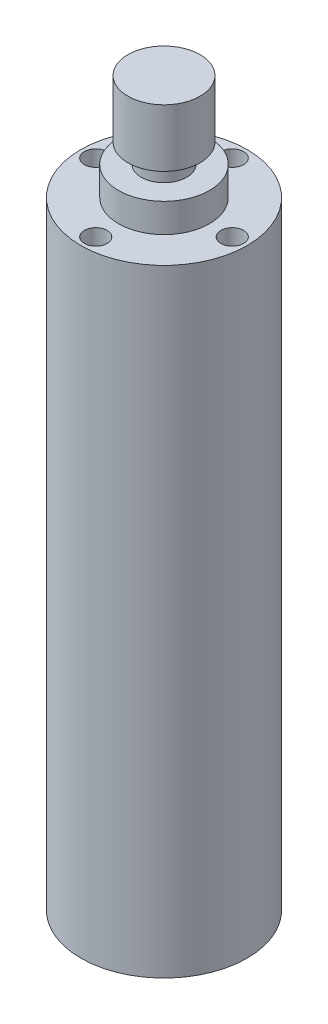
ISO-10303-21;
HEADER;
FILE_DESCRIPTION(('STEP AP214'),'2;1');
FILE_NAME('part.step','',(''),(''),'','','');
FILE_SCHEMA(('AUTOMOTIVE_DESIGN { 1 0 10303 214 1 1 1 1 }'));
ENDSEC;
DATA;
#1=APPLICATION_CONTEXT('core data for automotive mechanical design processes');
#2=APPLICATION_PROTOCOL_DEFINITION('international standard','automotive_design',2000,#1);
#3=PRODUCT_CONTEXT('',#1,'mechanical');
#4=PRODUCT('Part','Part','',(#3));
#5=PRODUCT_RELATED_PRODUCT_CATEGORY('part','',(#4));
#6=PRODUCT_DEFINITION_FORMATION('','',#4);
#7=PRODUCT_DEFINITION_CONTEXT('part definition',#1,'design');
#8=PRODUCT_DEFINITION('design','',#6,#7);
#9=PRODUCT_DEFINITION_SHAPE('','',#8);
#10=(LENGTH_UNIT() NAMED_UNIT(*) SI_UNIT(.MILLI.,.METRE.));
#11=(NAMED_UNIT(*) PLANE_ANGLE_UNIT() SI_UNIT($,.RADIAN.));
#12=(NAMED_UNIT(*) SI_UNIT($,.STERADIAN.) SOLID_ANGLE_UNIT());
#13=UNCERTAINTY_MEASURE_WITH_UNIT(LENGTH_MEASURE(1.E-05),#10,'distance_accuracy_value','');
#14=(GEOMETRIC_REPRESENTATION_CONTEXT(3) GLOBAL_UNCERTAINTY_ASSIGNED_CONTEXT((#13)) GLOBAL_UNIT_ASSIGNED_CONTEXT((#10,
#11,#12)) REPRESENTATION_CONTEXT('',''));
#15=CARTESIAN_POINT('',(0.,0.,0.));
#16=DIRECTION('',(0.,0.,1.));
#17=DIRECTION('',(1.,0.,0.));
#18=AXIS2_PLACEMENT_3D('',#15,#16,#17);
#19=CARTESIAN_POINT('',(0.,40.767,0.));
#20=DIRECTION('',(0.,-1.,0.));
#21=DIRECTION('',(0.,0.,-1.));
#22=AXIS2_PLACEMENT_3D('',#19,#20,#21);
#23=CYLINDRICAL_SURFACE('',#22,10.9855);
#24=CARTESIAN_POINT('',(0.,40.767,0.));
#25=DIRECTION('',(0.,1.,0.));
#26=DIRECTION('',(0.,0.,1.));
#27=AXIS2_PLACEMENT_3D('',#24,#25,#26);
#28=CIRCLE('',#27,10.9855);
#29=CARTESIAN_POINT('',(0.,40.767,10.9855));
#30=VERTEX_POINT('',#29);
#31=EDGE_CURVE('E51',#30,#30,#28,.T.);
#32=ORIENTED_EDGE('',*,*,#31,.F.);
#33=EDGE_LOOP('',(#32));
#34=FACE_BOUND('',#33,.T.);
#35=CARTESIAN_POINT('',(0.,-40.767,0.));
#36=DIRECTION('',(0.,1.,0.));
#37=DIRECTION('',(0.,0.,1.));
#38=AXIS2_PLACEMENT_3D('',#35,#36,#37);
#39=CIRCLE('',#38,10.9855);
#40=CARTESIAN_POINT('',(0.,-40.767,10.9855));
#41=VERTEX_POINT('',#40);
#42=EDGE_CURVE('E40',#41,#41,#39,.T.);
#43=ORIENTED_EDGE('',*,*,#42,.T.);
#44=EDGE_LOOP('',(#43));
#45=FACE_BOUND('',#44,.T.);
#46=ADVANCED_FACE('F37',(#34,#45),#23,.T.);
#47=CARTESIAN_POINT('',(0.,40.767,0.));
#48=DIRECTION('',(0.,1.,0.));
#49=DIRECTION('',(0.,0.,1.));
#50=AXIS2_PLACEMENT_3D('',#47,#48,#49);
#51=PLANE('',#50);
#52=CARTESIAN_POINT('',(-9.017,40.767,0.));
#53=DIRECTION('',(0.,1.,0.));
#54=DIRECTION('',(1.,0.,0.));
#55=AXIS2_PLACEMENT_3D('',#52,#53,#54);
#56=CIRCLE('',#55,1.5);
#57=CARTESIAN_POINT('',(-9.017,40.767,1.50000000000003));
#58=VERTEX_POINT('',#57);
#59=EDGE_CURVE('E276',#58,#58,#56,.T.);
#60=ORIENTED_EDGE('',*,*,#59,.F.);
#61=EDGE_LOOP('',(#60));
#62=FACE_BOUND('',#61,.T.);
#63=CARTESIAN_POINT('',(0.,40.767,9.017));
#64=DIRECTION('',(0.,1.,0.));
#65=DIRECTION('',(0.,0.,-1.));
#66=AXIS2_PLACEMENT_3D('',#63,#64,#65);
#67=CIRCLE('',#66,1.5);
#68=CARTESIAN_POINT('',(0.,40.767,10.517));
#69=VERTEX_POINT('',#68);
#70=EDGE_CURVE('E268',#69,#69,#67,.T.);
#71=ORIENTED_EDGE('',*,*,#70,.F.);
#72=EDGE_LOOP('',(#71));
#73=FACE_BOUND('',#72,.T.);
#74=CARTESIAN_POINT('',(9.017,40.767,0.));
#75=DIRECTION('',(0.,1.,0.));
#76=DIRECTION('',(-1.,0.,0.));
#77=AXIS2_PLACEMENT_3D('',#74,#75,#76);
#78=CIRCLE('',#77,1.5);
#79=CARTESIAN_POINT('',(9.017,40.767,1.49999999999991));
#80=VERTEX_POINT('',#79);
#81=EDGE_CURVE('E260',#80,#80,#78,.T.);
#82=ORIENTED_EDGE('',*,*,#81,.F.);
#83=EDGE_LOOP('',(#82));
#84=FACE_BOUND('',#83,.T.);
#85=CARTESIAN_POINT('',(0.,40.767,-9.017));
#86=DIRECTION('',(0.,1.,0.));
#87=DIRECTION('',(0.,0.,1.));
#88=AXIS2_PLACEMENT_3D('',#85,#86,#87);
#89=CIRCLE('',#88,1.5);
#90=CARTESIAN_POINT('',(0.,40.767,-7.517));
#91=VERTEX_POINT('',#90);
#92=EDGE_CURVE('E252',#91,#91,#89,.T.);
#93=ORIENTED_EDGE('',*,*,#92,.F.);
#94=EDGE_LOOP('',(#93));
#95=FACE_BOUND('',#94,.T.);
#96=CARTESIAN_POINT('',(0.,40.767,0.));
#97=DIRECTION('',(0.,1.,0.));
#98=DIRECTION('',(0.,0.,1.));
#99=AXIS2_PLACEMENT_3D('',#96,#97,#98);
#100=CIRCLE('',#99,6.0071);
#101=CARTESIAN_POINT('',(0.,40.767,-6.0071));
#102=VERTEX_POINT('',#101);
#103=EDGE_CURVE('E45',#102,#102,#100,.T.);
#104=ORIENTED_EDGE('',*,*,#103,.F.);
#105=EDGE_LOOP('',(#104));
#106=FACE_BOUND('',#105,.T.);
#107=ORIENTED_EDGE('',*,*,#31,.T.);
#108=EDGE_LOOP('',(#107));
#109=FACE_BOUND('',#108,.T.);
#110=ADVANCED_FACE('F72',(#62,#73,#84,#95,#106,#109),#51,.T.);
#111=CARTESIAN_POINT('',(0.,-40.767,0.));
#112=DIRECTION('',(0.,1.,0.));
#113=DIRECTION('',(0.,0.,1.));
#114=AXIS2_PLACEMENT_3D('',#111,#112,#113);
#115=PLANE('',#114);
#116=ORIENTED_EDGE('',*,*,#42,.F.);
#117=EDGE_LOOP('',(#116));
#118=FACE_BOUND('',#117,.T.);
#119=ADVANCED_FACE('F69',(#118),#115,.F.);
#120=CARTESIAN_POINT('',(0.,44.577,0.));
#121=DIRECTION('',(0.,-1.,0.));
#122=DIRECTION('',(0.,0.,-1.));
#123=AXIS2_PLACEMENT_3D('',#120,#121,#122);
#124=CYLINDRICAL_SURFACE('',#123,6.0071);
#125=CARTESIAN_POINT('',(0.,44.577,0.));
#126=DIRECTION('',(0.,1.,0.));
#127=DIRECTION('',(0.,0.,1.));
#128=AXIS2_PLACEMENT_3D('',#125,#126,#127);
#129=CIRCLE('',#128,6.0071);
#130=CARTESIAN_POINT('',(0.,44.577,-6.0071));
#131=VERTEX_POINT('',#130);
#132=EDGE_CURVE('E57',#131,#131,#129,.T.);
#133=CARTESIAN_POINT('',(0.,44.577,-6.0071));
#134=CARTESIAN_POINT('',(0.,44.5373125,-6.0071));
#135=CARTESIAN_POINT('',(0.,44.497625,-6.0071));
#136=CARTESIAN_POINT('',(0.,44.41825,-6.0071));
#137=CARTESIAN_POINT('',(0.,44.3785625,-6.0071));
#138=CARTESIAN_POINT('',(0.,44.2991875,-6.0071));
#139=CARTESIAN_POINT('',(0.,44.2595,-6.0071));
#140=CARTESIAN_POINT('',(0.,44.180125,-6.0071));
#141=CARTESIAN_POINT('',(0.,44.1404375,-6.0071));
#142=CARTESIAN_POINT('',(0.,44.0610625,-6.0071));
#143=CARTESIAN_POINT('',(0.,44.021375,-6.0071));
#144=CARTESIAN_POINT('',(0.,43.942,-6.0071));
#145=CARTESIAN_POINT('',(0.,43.9023125,-6.0071));
#146=CARTESIAN_POINT('',(0.,43.8229375,-6.0071));
#147=CARTESIAN_POINT('',(0.,43.78325,-6.0071));
#148=CARTESIAN_POINT('',(0.,43.703875,-6.0071));
#149=CARTESIAN_POINT('',(0.,43.6641875,-6.0071));
#150=CARTESIAN_POINT('',(0.,43.5848125,-6.0071));
#151=CARTESIAN_POINT('',(0.,43.545125,-6.0071));
#152=CARTESIAN_POINT('',(0.,43.46575,-6.0071));
#153=CARTESIAN_POINT('',(0.,43.4260625,-6.0071));
#154=CARTESIAN_POINT('',(0.,43.3466875,-6.0071));
#155=CARTESIAN_POINT('',(0.,43.307,-6.0071));
#156=CARTESIAN_POINT('',(0.,43.227625,-6.0071));
#157=CARTESIAN_POINT('',(0.,43.1879375,-6.0071));
#158=CARTESIAN_POINT('',(0.,43.1085625,-6.0071));
#159=CARTESIAN_POINT('',(0.,43.068875,-6.0071));
#160=CARTESIAN_POINT('',(0.,42.9895,-6.0071));
#161=CARTESIAN_POINT('',(0.,42.9498125,-6.0071));
#162=CARTESIAN_POINT('',(0.,42.8704375,-6.0071));
#163=CARTESIAN_POINT('',(0.,42.83075,-6.0071));
#164=CARTESIAN_POINT('',(0.,42.751375,-6.0071));
#165=CARTESIAN_POINT('',(0.,42.7116875,-6.0071));
#166=CARTESIAN_POINT('',(0.,42.6323125,-6.0071));
#167=CARTESIAN_POINT('',(0.,42.592625,-6.0071));
#168=CARTESIAN_POINT('',(0.,42.51325,-6.0071));
#169=CARTESIAN_POINT('',(0.,42.4735625,-6.0071));
#170=CARTESIAN_POINT('',(0.,42.3941875,-6.0071));
#171=CARTESIAN_POINT('',(0.,42.3545,-6.0071));
#172=CARTESIAN_POINT('',(0.,42.275125,-6.0071));
#173=CARTESIAN_POINT('',(0.,42.2354375,-6.0071));
#174=CARTESIAN_POINT('',(0.,42.1560625,-6.0071));
#175=CARTESIAN_POINT('',(0.,42.116375,-6.0071));
#176=CARTESIAN_POINT('',(0.,42.037,-6.0071));
#177=CARTESIAN_POINT('',(0.,41.9973125,-6.0071));
#178=CARTESIAN_POINT('',(0.,41.9179375,-6.0071));
#179=CARTESIAN_POINT('',(0.,41.87825,-6.0071));
#180=CARTESIAN_POINT('',(0.,41.798875,-6.0071));
#181=CARTESIAN_POINT('',(0.,41.7591875,-6.0071));
#182=CARTESIAN_POINT('',(0.,41.6798125,-6.0071));
#183=CARTESIAN_POINT('',(0.,41.640125,-6.0071));
#184=CARTESIAN_POINT('',(0.,41.56075,-6.0071));
#185=CARTESIAN_POINT('',(0.,41.5210625,-6.0071));
#186=CARTESIAN_POINT('',(0.,41.4416875,-6.0071));
#187=CARTESIAN_POINT('',(0.,41.402,-6.0071));
#188=CARTESIAN_POINT('',(0.,41.322625,-6.0071));
#189=CARTESIAN_POINT('',(0.,41.2829375,-6.0071));
#190=CARTESIAN_POINT('',(0.,41.2035625,-6.0071));
#191=CARTESIAN_POINT('',(0.,41.163875,-6.0071));
#192=CARTESIAN_POINT('',(0.,41.0845,-6.0071));
#193=CARTESIAN_POINT('',(0.,41.0448125,-6.0071));
#194=CARTESIAN_POINT('',(0.,40.9654375,-6.0071));
#195=CARTESIAN_POINT('',(0.,40.92575,-6.0071));
#196=CARTESIAN_POINT('',(0.,40.846375,-6.0071));
#197=CARTESIAN_POINT('',(0.,40.8066875,-6.0071));
#198=CARTESIAN_POINT('',(0.,40.767,-6.0071));
#199=B_SPLINE_CURVE_WITH_KNOTS('',3,(#133,#134,#135,#136,#137,#138,#139,#140,#141,#142,#143,
#144,#145,#146,#147,#148,#149,#150,#151,#152,#153,#154,#155,#156,#157,#158,#159,#160,#161,#162,
#163,#164,#165,#166,#167,#168,#169,#170,#171,#172,#173,#174,#175,#176,#177,#178,#179,#180,#181,
#182,#183,#184,#185,#186,#187,#188,#189,#190,#191,#192,#193,#194,#195,#196,#197,#198),
.UNSPECIFIED.,.F.,.F.,(4,2,2,2,2,2,2,2,2,2,2,2,2,2,2,2,2,2,2,2,2,2,2,2,2,2,2,2,2,2,2,2,4),(0.,
0.119062499999996,0.238124999999999,0.357187499999995,0.476249999999998,0.595312499999993,
0.714374999999996,0.833437499999999,0.952499999999995,1.0715625,1.19062499999999,1.3096875,
1.42875,1.5478125,1.666875,1.78593749999999,1.905,2.0240625,2.143125,2.2621875,2.38124999999999,
2.5003125,2.619375,2.7384375,2.8575,2.97656249999999,3.095625,3.2146875,3.33375,3.4528125,
3.571875,3.6909375,3.81),.UNSPECIFIED.);
#200=EDGE_CURVE('BSEAM71',#131,#102,#199,.T.);
#201=ORIENTED_EDGE('',*,*,#132,.F.);
#202=ORIENTED_EDGE('',*,*,#103,.T.);
#203=ORIENTED_EDGE('',*,*,#200,.T.);
#204=ORIENTED_EDGE('',*,*,#200,.F.);
#205=EDGE_LOOP('',(#201,#203,#202,#204));
#206=FACE_BOUND('',#205,.T.);
#207=ADVANCED_FACE('F71',(#206),#124,.T.);
#208=CARTESIAN_POINT('',(0.,44.577,0.));
#209=DIRECTION('',(0.,1.,0.));
#210=DIRECTION('',(0.,0.,1.));
#211=AXIS2_PLACEMENT_3D('',#208,#209,#210);
#212=PLANE('',#211);
#213=CARTESIAN_POINT('',(0.,44.577,0.));
#214=DIRECTION('',(0.,1.,0.));
#215=DIRECTION('',(0.,0.,1.));
#216=AXIS2_PLACEMENT_3D('',#213,#214,#215);
#217=CIRCLE('',#216,2.9972);
#218=CARTESIAN_POINT('',(0.,44.577,2.9972));
#219=VERTEX_POINT('',#218);
#220=EDGE_CURVE('E10',#219,#219,#217,.T.);
#221=ORIENTED_EDGE('',*,*,#220,.F.);
#222=EDGE_LOOP('',(#221));
#223=FACE_BOUND('',#222,.T.);
#224=ORIENTED_EDGE('',*,*,#132,.T.);
#225=EDGE_LOOP('',(#224));
#226=FACE_BOUND('',#225,.T.);
#227=ADVANCED_FACE('F77',(#223,#226),#212,.T.);
#228=CARTESIAN_POINT('',(0.,47.117,0.));
#229=DIRECTION('',(0.,-1.,0.));
#230=DIRECTION('',(0.,0.,-1.));
#231=AXIS2_PLACEMENT_3D('',#228,#229,#230);
#232=CYLINDRICAL_SURFACE('',#231,2.9972);
#233=CARTESIAN_POINT('',(0.,47.117,0.));
#234=DIRECTION('',(0.,1.,0.));
#235=DIRECTION('',(0.,0.,1.));
#236=AXIS2_PLACEMENT_3D('',#233,#234,#235);
#237=CIRCLE('',#236,2.9972);
#238=CARTESIAN_POINT('',(0.,47.117,2.9972));
#239=VERTEX_POINT('',#238);
#240=EDGE_CURVE('E55',#239,#239,#237,.T.);
#241=ORIENTED_EDGE('',*,*,#240,.F.);
#242=EDGE_LOOP('',(#241));
#243=FACE_BOUND('',#242,.T.);
#244=ORIENTED_EDGE('',*,*,#220,.T.);
#245=EDGE_LOOP('',(#244));
#246=FACE_BOUND('',#245,.T.);
#247=ADVANCED_FACE('F180',(#243,#246),#232,.T.);
#248=CARTESIAN_POINT('',(0.,54.737,0.));
#249=DIRECTION('',(0.,-1.,0.));
#250=DIRECTION('',(0.,0.,-1.));
#251=AXIS2_PLACEMENT_3D('',#248,#249,#250);
#252=CYLINDRICAL_SURFACE('',#251,4.7625);
#253=CARTESIAN_POINT('',(0.,54.737,0.));
#254=DIRECTION('',(0.,1.,0.));
#255=DIRECTION('',(0.,0.,1.));
#256=AXIS2_PLACEMENT_3D('',#253,#254,#255);
#257=CIRCLE('',#256,4.7625);
#258=CARTESIAN_POINT('',(0.,54.737,-4.7625));
#259=VERTEX_POINT('',#258);
#260=EDGE_CURVE('E242',#259,#259,#257,.T.);
#261=CARTESIAN_POINT('',(0.,47.117,0.));
#262=DIRECTION('',(0.,1.,0.));
#263=DIRECTION('',(0.,0.,1.));
#264=AXIS2_PLACEMENT_3D('',#261,#262,#263);
#265=CIRCLE('',#264,4.7625);
#266=CARTESIAN_POINT('',(0.,47.117,-4.7625));
#267=VERTEX_POINT('',#266);
#268=EDGE_CURVE('E245',#267,#267,#265,.T.);
#269=CARTESIAN_POINT('',(0.,54.737,-4.7625));
#270=CARTESIAN_POINT('',(0.,54.657625,-4.7625));
#271=CARTESIAN_POINT('',(0.,54.57825,-4.7625));
#272=CARTESIAN_POINT('',(0.,54.4195,-4.7625));
#273=CARTESIAN_POINT('',(0.,54.340125,-4.7625));
#274=CARTESIAN_POINT('',(0.,54.181375,-4.7625));
#275=CARTESIAN_POINT('',(0.,54.102,-4.7625));
#276=CARTESIAN_POINT('',(0.,53.94325,-4.7625));
#277=CARTESIAN_POINT('',(0.,53.863875,-4.7625));
#278=CARTESIAN_POINT('',(0.,53.705125,-4.7625));
#279=CARTESIAN_POINT('',(0.,53.62575,-4.7625));
#280=CARTESIAN_POINT('',(0.,53.467,-4.7625));
#281=CARTESIAN_POINT('',(0.,53.387625,-4.7625));
#282=CARTESIAN_POINT('',(0.,53.228875,-4.7625));
#283=CARTESIAN_POINT('',(0.,53.1495,-4.7625));
#284=CARTESIAN_POINT('',(0.,52.99075,-4.7625));
#285=CARTESIAN_POINT('',(0.,52.911375,-4.7625));
#286=CARTESIAN_POINT('',(0.,52.752625,-4.7625));
#287=CARTESIAN_POINT('',(0.,52.67325,-4.7625));
#288=CARTESIAN_POINT('',(0.,52.5145,-4.7625));
#289=CARTESIAN_POINT('',(0.,52.435125,-4.7625));
#290=CARTESIAN_POINT('',(0.,52.276375,-4.7625));
#291=CARTESIAN_POINT('',(0.,52.197,-4.7625));
#292=CARTESIAN_POINT('',(0.,52.03825,-4.7625));
#293=CARTESIAN_POINT('',(0.,51.958875,-4.7625));
#294=CARTESIAN_POINT('',(0.,51.800125,-4.7625));
#295=CARTESIAN_POINT('',(0.,51.72075,-4.7625));
#296=CARTESIAN_POINT('',(0.,51.562,-4.7625));
#297=CARTESIAN_POINT('',(0.,51.482625,-4.7625));
#298=CARTESIAN_POINT('',(0.,51.323875,-4.7625));
#299=CARTESIAN_POINT('',(0.,51.2445,-4.7625));
#300=CARTESIAN_POINT('',(0.,51.08575,-4.7625));
#301=CARTESIAN_POINT('',(0.,51.006375,-4.7625));
#302=CARTESIAN_POINT('',(0.,50.847625,-4.7625));
#303=CARTESIAN_POINT('',(0.,50.76825,-4.7625));
#304=CARTESIAN_POINT('',(0.,50.6095,-4.7625));
#305=CARTESIAN_POINT('',(0.,50.530125,-4.7625));
#306=CARTESIAN_POINT('',(0.,50.371375,-4.7625));
#307=CARTESIAN_POINT('',(0.,50.292,-4.7625));
#308=CARTESIAN_POINT('',(0.,50.13325,-4.7625));
#309=CARTESIAN_POINT('',(0.,50.053875,-4.7625));
#310=CARTESIAN_POINT('',(0.,49.895125,-4.7625));
#311=CARTESIAN_POINT('',(0.,49.81575,-4.7625));
#312=CARTESIAN_POINT('',(0.,49.657,-4.7625));
#313=CARTESIAN_POINT('',(0.,49.577625,-4.7625));
#314=CARTESIAN_POINT('',(0.,49.418875,-4.7625));
#315=CARTESIAN_POINT('',(0.,49.3395,-4.7625));
#316=CARTESIAN_POINT('',(0.,49.18075,-4.7625));
#317=CARTESIAN_POINT('',(0.,49.101375,-4.7625));
#318=CARTESIAN_POINT('',(0.,48.942625,-4.7625));
#319=CARTESIAN_POINT('',(0.,48.86325,-4.7625));
#320=CARTESIAN_POINT('',(0.,48.7045,-4.7625));
#321=CARTESIAN_POINT('',(0.,48.625125,-4.7625));
#322=CARTESIAN_POINT('',(0.,48.466375,-4.7625));
#323=CARTESIAN_POINT('',(0.,48.387,-4.7625));
#324=CARTESIAN_POINT('',(0.,48.22825,-4.7625));
#325=CARTESIAN_POINT('',(0.,48.148875,-4.7625));
#326=CARTESIAN_POINT('',(0.,47.990125,-4.7625));
#327=CARTESIAN_POINT('',(0.,47.91075,-4.7625));
#328=CARTESIAN_POINT('',(0.,47.752,-4.7625));
#329=CARTESIAN_POINT('',(0.,47.672625,-4.7625));
#330=CARTESIAN_POINT('',(0.,47.513875,-4.7625));
#331=CARTESIAN_POINT('',(0.,47.4345,-4.7625));
#332=CARTESIAN_POINT('',(0.,47.27575,-4.7625));
#333=CARTESIAN_POINT('',(0.,47.196375,-4.7625));
#334=CARTESIAN_POINT('',(0.,47.117,-4.7625));
#335=B_SPLINE_CURVE_WITH_KNOTS('',3,(#269,#270,#271,#272,#273,#274,#275,#276,#277,#278,#279,
#280,#281,#282,#283,#284,#285,#286,#287,#288,#289,#290,#291,#292,#293,#294,#295,#296,#297,#298,
#299,#300,#301,#302,#303,#304,#305,#306,#307,#308,#309,#310,#311,#312,#313,#314,#315,#316,#317,
#318,#319,#320,#321,#322,#323,#324,#325,#326,#327,#328,#329,#330,#331,#332,#333,#334),
.UNSPECIFIED.,.F.,.F.,(4,2,2,2,2,2,2,2,2,2,2,2,2,2,2,2,2,2,2,2,2,2,2,2,2,2,2,2,2,2,2,2,4),(0.,
0.238125000000006,0.476250000000004,0.714375000000003,0.952500000000002,1.190625,
1.42875000000001,1.66687500000001,1.905,2.143125,2.38125,2.619375,2.85750000000001,3.095625,
3.33375,3.571875,3.81,4.04812500000001,4.28625000000001,4.524375,4.7625,5.000625,
5.23875000000001,5.47687500000001,5.71500000000001,5.953125,6.19125,6.429375,6.66750000000001,
6.90562500000001,7.14375,7.381875,7.62),.UNSPECIFIED.);
#336=EDGE_CURVE('BSEAM173',#259,#267,#335,.T.);
#337=ORIENTED_EDGE('',*,*,#260,.F.);
#338=ORIENTED_EDGE('',*,*,#268,.T.);
#339=ORIENTED_EDGE('',*,*,#336,.T.);
#340=ORIENTED_EDGE('',*,*,#336,.F.);
#341=EDGE_LOOP('',(#337,#339,#338,#340));
#342=FACE_BOUND('',#341,.T.);
#343=ADVANCED_FACE('F173',(#342),#252,.T.);
#344=CARTESIAN_POINT('',(0.,54.737,0.));
#345=DIRECTION('',(0.,1.,0.));
#346=DIRECTION('',(0.,0.,1.));
#347=AXIS2_PLACEMENT_3D('',#344,#345,#346);
#348=PLANE('',#347);
#349=ORIENTED_EDGE('',*,*,#260,.T.);
#350=EDGE_LOOP('',(#349));
#351=FACE_BOUND('',#350,.T.);
#352=ADVANCED_FACE('F170',(#351),#348,.T.);
#353=CARTESIAN_POINT('',(0.,47.117,0.));
#354=DIRECTION('',(0.,1.,0.));
#355=DIRECTION('',(0.,0.,1.));
#356=AXIS2_PLACEMENT_3D('',#353,#354,#355);
#357=PLANE('',#356);
#358=ORIENTED_EDGE('',*,*,#240,.T.);
#359=EDGE_LOOP('',(#358));
#360=FACE_BOUND('',#359,.T.);
#361=ORIENTED_EDGE('',*,*,#268,.F.);
#362=EDGE_LOOP('',(#361));
#363=FACE_BOUND('',#362,.T.);
#364=ADVANCED_FACE('F168',(#360,#363),#357,.F.);
#365=CARTESIAN_POINT('',(0.,33.147,-9.017));
#366=DIRECTION('',(0.,1.,0.));
#367=DIRECTION('',(0.,0.,1.));
#368=AXIS2_PLACEMENT_3D('',#365,#366,#367);
#369=CYLINDRICAL_SURFACE('',#368,1.5);
#370=CARTESIAN_POINT('',(0.,33.147,-9.017));
#371=DIRECTION('',(0.,1.,0.));
#372=DIRECTION('',(0.,0.,1.));
#373=AXIS2_PLACEMENT_3D('',#370,#371,#372);
#374=CIRCLE('',#373,1.5);
#375=CARTESIAN_POINT('',(0.,33.147,-7.517));
#376=VERTEX_POINT('',#375);
#377=EDGE_CURVE('E250',#376,#376,#374,.T.);
#378=CARTESIAN_POINT('',(0.,33.147,-7.517));
#379=CARTESIAN_POINT('',(0.,33.226375,-7.517));
#380=CARTESIAN_POINT('',(0.,33.30575,-7.517));
#381=CARTESIAN_POINT('',(0.,33.4645,-7.517));
#382=CARTESIAN_POINT('',(0.,33.543875,-7.517));
#383=CARTESIAN_POINT('',(0.,33.702625,-7.517));
#384=CARTESIAN_POINT('',(0.,33.782,-7.517));
#385=CARTESIAN_POINT('',(0.,33.94075,-7.517));
#386=CARTESIAN_POINT('',(0.,34.020125,-7.517));
#387=CARTESIAN_POINT('',(0.,34.178875,-7.517));
#388=CARTESIAN_POINT('',(0.,34.25825,-7.517));
#389=CARTESIAN_POINT('',(0.,34.417,-7.517));
#390=CARTESIAN_POINT('',(0.,34.496375,-7.517));
#391=CARTESIAN_POINT('',(0.,34.655125,-7.517));
#392=CARTESIAN_POINT('',(0.,34.7345,-7.517));
#393=CARTESIAN_POINT('',(0.,34.89325,-7.517));
#394=CARTESIAN_POINT('',(0.,34.972625,-7.517));
#395=CARTESIAN_POINT('',(0.,35.131375,-7.517));
#396=CARTESIAN_POINT('',(0.,35.21075,-7.517));
#397=CARTESIAN_POINT('',(0.,35.3695,-7.517));
#398=CARTESIAN_POINT('',(0.,35.448875,-7.517));
#399=CARTESIAN_POINT('',(0.,35.607625,-7.517));
#400=CARTESIAN_POINT('',(0.,35.687,-7.517));
#401=CARTESIAN_POINT('',(0.,35.84575,-7.517));
#402=CARTESIAN_POINT('',(0.,35.925125,-7.517));
#403=CARTESIAN_POINT('',(0.,36.083875,-7.517));
#404=CARTESIAN_POINT('',(0.,36.16325,-7.517));
#405=CARTESIAN_POINT('',(0.,36.322,-7.517));
#406=CARTESIAN_POINT('',(0.,36.401375,-7.517));
#407=CARTESIAN_POINT('',(0.,36.560125,-7.517));
#408=CARTESIAN_POINT('',(0.,36.6395,-7.517));
#409=CARTESIAN_POINT('',(0.,36.79825,-7.517));
#410=CARTESIAN_POINT('',(0.,36.877625,-7.517));
#411=CARTESIAN_POINT('',(0.,37.036375,-7.517));
#412=CARTESIAN_POINT('',(0.,37.11575,-7.517));
#413=CARTESIAN_POINT('',(0.,37.2745,-7.517));
#414=CARTESIAN_POINT('',(0.,37.353875,-7.517));
#415=CARTESIAN_POINT('',(0.,37.512625,-7.517));
#416=CARTESIAN_POINT('',(0.,37.592,-7.517));
#417=CARTESIAN_POINT('',(0.,37.75075,-7.517));
#418=CARTESIAN_POINT('',(0.,37.830125,-7.517));
#419=CARTESIAN_POINT('',(0.,37.988875,-7.517));
#420=CARTESIAN_POINT('',(0.,38.06825,-7.517));
#421=CARTESIAN_POINT('',(0.,38.227,-7.517));
#422=CARTESIAN_POINT('',(0.,38.306375,-7.517));
#423=CARTESIAN_POINT('',(0.,38.465125,-7.517));
#424=CARTESIAN_POINT('',(0.,38.5445,-7.517));
#425=CARTESIAN_POINT('',(0.,38.70325,-7.517));
#426=CARTESIAN_POINT('',(0.,38.782625,-7.517));
#427=CARTESIAN_POINT('',(0.,38.941375,-7.517));
#428=CARTESIAN_POINT('',(0.,39.02075,-7.517));
#429=CARTESIAN_POINT('',(0.,39.1795,-7.517));
#430=CARTESIAN_POINT('',(0.,39.258875,-7.517));
#431=CARTESIAN_POINT('',(0.,39.417625,-7.517));
#432=CARTESIAN_POINT('',(0.,39.497,-7.517));
#433=CARTESIAN_POINT('',(0.,39.65575,-7.517));
#434=CARTESIAN_POINT('',(0.,39.735125,-7.517));
#435=CARTESIAN_POINT('',(0.,39.893875,-7.517));
#436=CARTESIAN_POINT('',(0.,39.97325,-7.517));
#437=CARTESIAN_POINT('',(0.,40.132,-7.517));
#438=CARTESIAN_POINT('',(0.,40.211375,-7.517));
#439=CARTESIAN_POINT('',(0.,40.370125,-7.517));
#440=CARTESIAN_POINT('',(0.,40.4495,-7.517));
#441=CARTESIAN_POINT('',(0.,40.60825,-7.517));
#442=CARTESIAN_POINT('',(0.,40.687625,-7.517));
#443=CARTESIAN_POINT('',(0.,40.767,-7.517));
#444=B_SPLINE_CURVE_WITH_KNOTS('',3,(#378,#379,#380,#381,#382,#383,#384,#385,#386,#387,#388,
#389,#390,#391,#392,#393,#394,#395,#396,#397,#398,#399,#400,#401,#402,#403,#404,#405,#406,#407,
#408,#409,#410,#411,#412,#413,#414,#415,#416,#417,#418,#419,#420,#421,#422,#423,#424,#425,#426,
#427,#428,#429,#430,#431,#432,#433,#434,#435,#436,#437,#438,#439,#440,#441,#442,#443),
.UNSPECIFIED.,.F.,.F.,(4,2,2,2,2,2,2,2,2,2,2,2,2,2,2,2,2,2,2,2,2,2,2,2,2,2,2,2,2,2,2,2,4),(0.,
0.238124999999999,0.476249999999998,0.714374999999996,0.952499999999995,1.19062499999999,
1.42875,1.666875,1.905,2.143125,2.38124999999999,2.61937499999999,2.8575,3.095625,3.33375,
3.571875,3.80999999999999,4.048125,4.28625,4.524375,4.7625,5.00062499999999,5.23875,5.476875,
5.715,5.953125,6.19125,6.42937499999999,6.6675,6.905625,7.14375,7.381875,7.61999999999999),.UNSPECIFIED.);
#445=EDGE_CURVE('BSEAM164',#376,#91,#444,.T.);
#446=ORIENTED_EDGE('',*,*,#377,.F.);
#447=ORIENTED_EDGE('',*,*,#92,.T.);
#448=ORIENTED_EDGE('',*,*,#445,.T.);
#449=ORIENTED_EDGE('',*,*,#445,.F.);
#450=EDGE_LOOP('',(#446,#448,#447,#449));
#451=FACE_BOUND('',#450,.T.);
#452=ADVANCED_FACE('F164',(#451),#369,.F.);
#453=CARTESIAN_POINT('',(0.,33.147,-9.017));
#454=DIRECTION('',(0.,1.,0.));
#455=DIRECTION('',(0.,0.,1.));
#456=AXIS2_PLACEMENT_3D('',#453,#454,#455);
#457=PLANE('',#456);
#458=ORIENTED_EDGE('',*,*,#377,.T.);
#459=EDGE_LOOP('',(#458));
#460=FACE_BOUND('',#459,.T.);
#461=ADVANCED_FACE('F97',(#460),#457,.T.);
#462=CARTESIAN_POINT('',(9.017,33.147,0.));
#463=DIRECTION('',(0.,1.,0.));
#464=DIRECTION('',(0.,0.,1.));
#465=AXIS2_PLACEMENT_3D('',#462,#463,#464);
#466=CYLINDRICAL_SURFACE('',#465,1.5);
#467=CARTESIAN_POINT('',(9.017,33.147,0.));
#468=DIRECTION('',(0.,1.,0.));
#469=DIRECTION('',(-1.,0.,0.));
#470=AXIS2_PLACEMENT_3D('',#467,#468,#469);
#471=CIRCLE('',#470,1.5);
#472=CARTESIAN_POINT('',(9.017,33.147,1.49999999999991));
#473=VERTEX_POINT('',#472);
#474=EDGE_CURVE('E264',#473,#473,#471,.T.);
#475=CARTESIAN_POINT('',(9.017,33.147,1.49999999999991));
#476=CARTESIAN_POINT('',(9.017,33.226375,1.49999999999991));
#477=CARTESIAN_POINT('',(9.017,33.30575,1.49999999999991));
#478=CARTESIAN_POINT('',(9.017,33.4645,1.49999999999991));
#479=CARTESIAN_POINT('',(9.017,33.543875,1.49999999999991));
#480=CARTESIAN_POINT('',(9.017,33.702625,1.49999999999991));
#481=CARTESIAN_POINT('',(9.017,33.782,1.49999999999991));
#482=CARTESIAN_POINT('',(9.017,33.94075,1.49999999999991));
#483=CARTESIAN_POINT('',(9.017,34.020125,1.49999999999991));
#484=CARTESIAN_POINT('',(9.017,34.178875,1.49999999999991));
#485=CARTESIAN_POINT('',(9.017,34.25825,1.49999999999991));
#486=CARTESIAN_POINT('',(9.017,34.417,1.49999999999991));
#487=CARTESIAN_POINT('',(9.017,34.496375,1.49999999999991));
#488=CARTESIAN_POINT('',(9.017,34.655125,1.49999999999991));
#489=CARTESIAN_POINT('',(9.017,34.7345,1.49999999999991));
#490=CARTESIAN_POINT('',(9.017,34.89325,1.49999999999991));
#491=CARTESIAN_POINT('',(9.017,34.972625,1.49999999999991));
#492=CARTESIAN_POINT('',(9.017,35.131375,1.49999999999991));
#493=CARTESIAN_POINT('',(9.017,35.21075,1.49999999999991));
#494=CARTESIAN_POINT('',(9.017,35.3695,1.49999999999991));
#495=CARTESIAN_POINT('',(9.017,35.448875,1.49999999999991));
#496=CARTESIAN_POINT('',(9.017,35.607625,1.49999999999991));
#497=CARTESIAN_POINT('',(9.017,35.687,1.49999999999991));
#498=CARTESIAN_POINT('',(9.017,35.84575,1.49999999999991));
#499=CARTESIAN_POINT('',(9.017,35.925125,1.49999999999991));
#500=CARTESIAN_POINT('',(9.017,36.083875,1.49999999999991));
#501=CARTESIAN_POINT('',(9.017,36.16325,1.49999999999991));
#502=CARTESIAN_POINT('',(9.017,36.322,1.49999999999991));
#503=CARTESIAN_POINT('',(9.017,36.401375,1.49999999999991));
#504=CARTESIAN_POINT('',(9.017,36.560125,1.49999999999991));
#505=CARTESIAN_POINT('',(9.017,36.6395,1.49999999999991));
#506=CARTESIAN_POINT('',(9.017,36.79825,1.49999999999991));
#507=CARTESIAN_POINT('',(9.017,36.877625,1.49999999999991));
#508=CARTESIAN_POINT('',(9.017,37.036375,1.49999999999991));
#509=CARTESIAN_POINT('',(9.017,37.11575,1.49999999999991));
#510=CARTESIAN_POINT('',(9.017,37.2745,1.49999999999991));
#511=CARTESIAN_POINT('',(9.017,37.353875,1.49999999999991));
#512=CARTESIAN_POINT('',(9.017,37.512625,1.49999999999991));
#513=CARTESIAN_POINT('',(9.017,37.592,1.49999999999991));
#514=CARTESIAN_POINT('',(9.017,37.75075,1.49999999999991));
#515=CARTESIAN_POINT('',(9.017,37.830125,1.49999999999991));
#516=CARTESIAN_POINT('',(9.017,37.988875,1.49999999999991));
#517=CARTESIAN_POINT('',(9.017,38.06825,1.49999999999991));
#518=CARTESIAN_POINT('',(9.017,38.227,1.49999999999991));
#519=CARTESIAN_POINT('',(9.017,38.306375,1.49999999999991));
#520=CARTESIAN_POINT('',(9.017,38.465125,1.49999999999991));
#521=CARTESIAN_POINT('',(9.017,38.5445,1.49999999999991));
#522=CARTESIAN_POINT('',(9.017,38.70325,1.49999999999991));
#523=CARTESIAN_POINT('',(9.017,38.782625,1.49999999999991));
#524=CARTESIAN_POINT('',(9.017,38.941375,1.49999999999991));
#525=CARTESIAN_POINT('',(9.017,39.02075,1.49999999999991));
#526=CARTESIAN_POINT('',(9.017,39.1795,1.49999999999991));
#527=CARTESIAN_POINT('',(9.017,39.258875,1.49999999999991));
#528=CARTESIAN_POINT('',(9.017,39.417625,1.49999999999991));
#529=CARTESIAN_POINT('',(9.017,39.497,1.49999999999991));
#530=CARTESIAN_POINT('',(9.017,39.65575,1.49999999999991));
#531=CARTESIAN_POINT('',(9.017,39.735125,1.49999999999991));
#532=CARTESIAN_POINT('',(9.017,39.893875,1.49999999999991));
#533=CARTESIAN_POINT('',(9.017,39.97325,1.49999999999991));
#534=CARTESIAN_POINT('',(9.017,40.132,1.49999999999991));
#535=CARTESIAN_POINT('',(9.017,40.211375,1.49999999999991));
#536=CARTESIAN_POINT('',(9.017,40.370125,1.49999999999991));
#537=CARTESIAN_POINT('',(9.017,40.4495,1.49999999999991));
#538=CARTESIAN_POINT('',(9.017,40.60825,1.49999999999991));
#539=CARTESIAN_POINT('',(9.017,40.687625,1.49999999999991));
#540=CARTESIAN_POINT('',(9.017,40.767,1.49999999999991));
#541=B_SPLINE_CURVE_WITH_KNOTS('',3,(#475,#476,#477,#478,#479,#480,#481,#482,#483,#484,#485,
#486,#487,#488,#489,#490,#491,#492,#493,#494,#495,#496,#497,#498,#499,#500,#501,#502,#503,#504,
#505,#506,#507,#508,#509,#510,#511,#512,#513,#514,#515,#516,#517,#518,#519,#520,#521,#522,#523,
#524,#525,#526,#527,#528,#529,#530,#531,#532,#533,#534,#535,#536,#537,#538,#539,#540),
.UNSPECIFIED.,.F.,.F.,(4,2,2,2,2,2,2,2,2,2,2,2,2,2,2,2,2,2,2,2,2,2,2,2,2,2,2,2,2,2,2,2,4),(0.,
0.238124999999999,0.476249999999998,0.714374999999996,0.952499999999995,1.19062499999999,
1.42875,1.666875,1.905,2.143125,2.38124999999999,2.61937499999999,2.8575,3.095625,3.33375,
3.571875,3.80999999999999,4.048125,4.28625,4.524375,4.7625,5.00062499999999,5.23875,5.476875,
5.715,5.953125,6.19125,6.42937499999999,6.6675,6.905625,7.14375,7.381875,7.61999999999999),.UNSPECIFIED.);
#542=EDGE_CURVE('BSEAM102',#473,#80,#541,.T.);
#543=ORIENTED_EDGE('',*,*,#474,.F.);
#544=ORIENTED_EDGE('',*,*,#81,.T.);
#545=ORIENTED_EDGE('',*,*,#542,.T.);
#546=ORIENTED_EDGE('',*,*,#542,.F.);
#547=EDGE_LOOP('',(#543,#545,#544,#546));
#548=FACE_BOUND('',#547,.T.);
#549=ADVANCED_FACE('F102',(#548),#466,.F.);
#550=CARTESIAN_POINT('',(9.017,33.147,0.));
#551=DIRECTION('',(0.,1.,0.));
#552=DIRECTION('',(-1.,0.,0.));
#553=AXIS2_PLACEMENT_3D('',#550,#551,#552);
#554=PLANE('',#553);
#555=ORIENTED_EDGE('',*,*,#474,.T.);
#556=EDGE_LOOP('',(#555));
#557=FACE_BOUND('',#556,.T.);
#558=ADVANCED_FACE('F107',(#557),#554,.T.);
#559=CARTESIAN_POINT('',(0.,33.147,9.017));
#560=DIRECTION('',(0.,1.,0.));
#561=DIRECTION('',(0.,0.,1.));
#562=AXIS2_PLACEMENT_3D('',#559,#560,#561);
#563=CYLINDRICAL_SURFACE('',#562,1.5);
#564=CARTESIAN_POINT('',(0.,33.147,9.017));
#565=DIRECTION('',(0.,1.,0.));
#566=DIRECTION('',(0.,0.,-1.));
#567=AXIS2_PLACEMENT_3D('',#564,#565,#566);
#568=CIRCLE('',#567,1.5);
#569=CARTESIAN_POINT('',(0.,33.147,10.517));
#570=VERTEX_POINT('',#569);
#571=EDGE_CURVE('E272',#570,#570,#568,.T.);
#572=CARTESIAN_POINT('',(0.,33.147,10.517));
#573=CARTESIAN_POINT('',(0.,33.226375,10.517));
#574=CARTESIAN_POINT('',(0.,33.30575,10.517));
#575=CARTESIAN_POINT('',(0.,33.4645,10.517));
#576=CARTESIAN_POINT('',(0.,33.543875,10.517));
#577=CARTESIAN_POINT('',(0.,33.702625,10.517));
#578=CARTESIAN_POINT('',(0.,33.782,10.517));
#579=CARTESIAN_POINT('',(0.,33.94075,10.517));
#580=CARTESIAN_POINT('',(0.,34.020125,10.517));
#581=CARTESIAN_POINT('',(0.,34.178875,10.517));
#582=CARTESIAN_POINT('',(0.,34.25825,10.517));
#583=CARTESIAN_POINT('',(0.,34.417,10.517));
#584=CARTESIAN_POINT('',(0.,34.496375,10.517));
#585=CARTESIAN_POINT('',(0.,34.655125,10.517));
#586=CARTESIAN_POINT('',(0.,34.7345,10.517));
#587=CARTESIAN_POINT('',(0.,34.89325,10.517));
#588=CARTESIAN_POINT('',(0.,34.972625,10.517));
#589=CARTESIAN_POINT('',(0.,35.131375,10.517));
#590=CARTESIAN_POINT('',(0.,35.21075,10.517));
#591=CARTESIAN_POINT('',(0.,35.3695,10.517));
#592=CARTESIAN_POINT('',(0.,35.448875,10.517));
#593=CARTESIAN_POINT('',(0.,35.607625,10.517));
#594=CARTESIAN_POINT('',(0.,35.687,10.517));
#595=CARTESIAN_POINT('',(0.,35.84575,10.517));
#596=CARTESIAN_POINT('',(0.,35.925125,10.517));
#597=CARTESIAN_POINT('',(0.,36.083875,10.517));
#598=CARTESIAN_POINT('',(0.,36.16325,10.517));
#599=CARTESIAN_POINT('',(0.,36.322,10.517));
#600=CARTESIAN_POINT('',(0.,36.401375,10.517));
#601=CARTESIAN_POINT('',(0.,36.560125,10.517));
#602=CARTESIAN_POINT('',(0.,36.6395,10.517));
#603=CARTESIAN_POINT('',(0.,36.79825,10.517));
#604=CARTESIAN_POINT('',(0.,36.877625,10.517));
#605=CARTESIAN_POINT('',(0.,37.036375,10.517));
#606=CARTESIAN_POINT('',(0.,37.11575,10.517));
#607=CARTESIAN_POINT('',(0.,37.2745,10.517));
#608=CARTESIAN_POINT('',(0.,37.353875,10.517));
#609=CARTESIAN_POINT('',(0.,37.512625,10.517));
#610=CARTESIAN_POINT('',(0.,37.592,10.517));
#611=CARTESIAN_POINT('',(0.,37.75075,10.517));
#612=CARTESIAN_POINT('',(0.,37.830125,10.517));
#613=CARTESIAN_POINT('',(0.,37.988875,10.517));
#614=CARTESIAN_POINT('',(0.,38.06825,10.517));
#615=CARTESIAN_POINT('',(0.,38.227,10.517));
#616=CARTESIAN_POINT('',(0.,38.306375,10.517));
#617=CARTESIAN_POINT('',(0.,38.465125,10.517));
#618=CARTESIAN_POINT('',(0.,38.5445,10.517));
#619=CARTESIAN_POINT('',(0.,38.70325,10.517));
#620=CARTESIAN_POINT('',(0.,38.782625,10.517));
#621=CARTESIAN_POINT('',(0.,38.941375,10.517));
#622=CARTESIAN_POINT('',(0.,39.02075,10.517));
#623=CARTESIAN_POINT('',(0.,39.1795,10.517));
#624=CARTESIAN_POINT('',(0.,39.258875,10.517));
#625=CARTESIAN_POINT('',(0.,39.417625,10.517));
#626=CARTESIAN_POINT('',(0.,39.497,10.517));
#627=CARTESIAN_POINT('',(0.,39.65575,10.517));
#628=CARTESIAN_POINT('',(0.,39.735125,10.517));
#629=CARTESIAN_POINT('',(0.,39.893875,10.517));
#630=CARTESIAN_POINT('',(0.,39.97325,10.517));
#631=CARTESIAN_POINT('',(0.,40.132,10.517));
#632=CARTESIAN_POINT('',(0.,40.211375,10.517));
#633=CARTESIAN_POINT('',(0.,40.370125,10.517));
#634=CARTESIAN_POINT('',(0.,40.4495,10.517));
#635=CARTESIAN_POINT('',(0.,40.60825,10.517));
#636=CARTESIAN_POINT('',(0.,40.687625,10.517));
#637=CARTESIAN_POINT('',(0.,40.767,10.517));
#638=B_SPLINE_CURVE_WITH_KNOTS('',3,(#572,#573,#574,#575,#576,#577,#578,#579,#580,#581,#582,
#583,#584,#585,#586,#587,#588,#589,#590,#591,#592,#593,#594,#595,#596,#597,#598,#599,#600,#601,
#602,#603,#604,#605,#606,#607,#608,#609,#610,#611,#612,#613,#614,#615,#616,#617,#618,#619,#620,
#621,#622,#623,#624,#625,#626,#627,#628,#629,#630,#631,#632,#633,#634,#635,#636,#637),
.UNSPECIFIED.,.F.,.F.,(4,2,2,2,2,2,2,2,2,2,2,2,2,2,2,2,2,2,2,2,2,2,2,2,2,2,2,2,2,2,2,2,4),(0.,
0.238124999999999,0.476249999999998,0.714374999999996,0.952499999999995,1.19062499999999,
1.42875,1.666875,1.905,2.143125,2.38124999999999,2.61937499999999,2.8575,3.095625,3.33375,
3.571875,3.80999999999999,4.048125,4.28625,4.524375,4.7625,5.00062499999999,5.23875,5.476875,
5.715,5.953125,6.19125,6.42937499999999,6.6675,6.905625,7.14375,7.381875,7.61999999999999),.UNSPECIFIED.);
#639=EDGE_CURVE('BSEAM117',#570,#69,#638,.T.);
#640=ORIENTED_EDGE('',*,*,#571,.F.);
#641=ORIENTED_EDGE('',*,*,#70,.T.);
#642=ORIENTED_EDGE('',*,*,#639,.T.);
#643=ORIENTED_EDGE('',*,*,#639,.F.);
#644=EDGE_LOOP('',(#640,#642,#641,#643));
#645=FACE_BOUND('',#644,.T.);
#646=ADVANCED_FACE('F117',(#645),#563,.F.);
#647=CARTESIAN_POINT('',(0.,33.147,9.017));
#648=DIRECTION('',(0.,1.,0.));
#649=DIRECTION('',(0.,0.,-1.));
#650=AXIS2_PLACEMENT_3D('',#647,#648,#649);
#651=PLANE('',#650);
#652=ORIENTED_EDGE('',*,*,#571,.T.);
#653=EDGE_LOOP('',(#652));
#654=FACE_BOUND('',#653,.T.);
#655=ADVANCED_FACE('F127',(#654),#651,.T.);
#656=CARTESIAN_POINT('',(-9.017,33.147,0.));
#657=DIRECTION('',(0.,1.,0.));
#658=DIRECTION('',(0.,0.,1.));
#659=AXIS2_PLACEMENT_3D('',#656,#657,#658);
#660=CYLINDRICAL_SURFACE('',#659,1.5);
#661=CARTESIAN_POINT('',(-9.017,33.147,0.));
#662=DIRECTION('',(0.,1.,0.));
#663=DIRECTION('',(1.,0.,0.));
#664=AXIS2_PLACEMENT_3D('',#661,#662,#663);
#665=CIRCLE('',#664,1.5);
#666=CARTESIAN_POINT('',(-9.017,33.147,1.50000000000003));
#667=VERTEX_POINT('',#666);
#668=EDGE_CURVE('E256',#667,#667,#665,.T.);
#669=CARTESIAN_POINT('',(-9.017,33.147,1.50000000000003));
#670=CARTESIAN_POINT('',(-9.017,33.226375,1.50000000000003));
#671=CARTESIAN_POINT('',(-9.017,33.30575,1.50000000000003));
#672=CARTESIAN_POINT('',(-9.017,33.4645,1.50000000000003));
#673=CARTESIAN_POINT('',(-9.017,33.543875,1.50000000000003));
#674=CARTESIAN_POINT('',(-9.017,33.702625,1.50000000000003));
#675=CARTESIAN_POINT('',(-9.017,33.782,1.50000000000003));
#676=CARTESIAN_POINT('',(-9.017,33.94075,1.50000000000003));
#677=CARTESIAN_POINT('',(-9.017,34.020125,1.50000000000003));
#678=CARTESIAN_POINT('',(-9.017,34.178875,1.50000000000003));
#679=CARTESIAN_POINT('',(-9.017,34.25825,1.50000000000003));
#680=CARTESIAN_POINT('',(-9.017,34.417,1.50000000000003));
#681=CARTESIAN_POINT('',(-9.017,34.496375,1.50000000000003));
#682=CARTESIAN_POINT('',(-9.017,34.655125,1.50000000000003));
#683=CARTESIAN_POINT('',(-9.017,34.7345,1.50000000000003));
#684=CARTESIAN_POINT('',(-9.017,34.89325,1.50000000000003));
#685=CARTESIAN_POINT('',(-9.017,34.972625,1.50000000000003));
#686=CARTESIAN_POINT('',(-9.017,35.131375,1.50000000000003));
#687=CARTESIAN_POINT('',(-9.017,35.21075,1.50000000000003));
#688=CARTESIAN_POINT('',(-9.017,35.3695,1.50000000000003));
#689=CARTESIAN_POINT('',(-9.017,35.448875,1.50000000000003));
#690=CARTESIAN_POINT('',(-9.017,35.607625,1.50000000000003));
#691=CARTESIAN_POINT('',(-9.017,35.687,1.50000000000003));
#692=CARTESIAN_POINT('',(-9.017,35.84575,1.50000000000003));
#693=CARTESIAN_POINT('',(-9.017,35.925125,1.50000000000003));
#694=CARTESIAN_POINT('',(-9.017,36.083875,1.50000000000003));
#695=CARTESIAN_POINT('',(-9.017,36.16325,1.50000000000003));
#696=CARTESIAN_POINT('',(-9.017,36.322,1.50000000000003));
#697=CARTESIAN_POINT('',(-9.017,36.401375,1.50000000000003));
#698=CARTESIAN_POINT('',(-9.017,36.560125,1.50000000000003));
#699=CARTESIAN_POINT('',(-9.017,36.6395,1.50000000000003));
#700=CARTESIAN_POINT('',(-9.017,36.79825,1.50000000000003));
#701=CARTESIAN_POINT('',(-9.017,36.877625,1.50000000000003));
#702=CARTESIAN_POINT('',(-9.017,37.036375,1.50000000000003));
#703=CARTESIAN_POINT('',(-9.017,37.11575,1.50000000000003));
#704=CARTESIAN_POINT('',(-9.017,37.2745,1.50000000000003));
#705=CARTESIAN_POINT('',(-9.017,37.353875,1.50000000000003));
#706=CARTESIAN_POINT('',(-9.017,37.512625,1.50000000000003));
#707=CARTESIAN_POINT('',(-9.017,37.592,1.50000000000003));
#708=CARTESIAN_POINT('',(-9.017,37.75075,1.50000000000003));
#709=CARTESIAN_POINT('',(-9.017,37.830125,1.50000000000003));
#710=CARTESIAN_POINT('',(-9.017,37.988875,1.50000000000003));
#711=CARTESIAN_POINT('',(-9.017,38.06825,1.50000000000003));
#712=CARTESIAN_POINT('',(-9.017,38.227,1.50000000000003));
#713=CARTESIAN_POINT('',(-9.017,38.306375,1.50000000000003));
#714=CARTESIAN_POINT('',(-9.017,38.465125,1.50000000000003));
#715=CARTESIAN_POINT('',(-9.017,38.5445,1.50000000000003));
#716=CARTESIAN_POINT('',(-9.017,38.70325,1.50000000000003));
#717=CARTESIAN_POINT('',(-9.017,38.782625,1.50000000000003));
#718=CARTESIAN_POINT('',(-9.017,38.941375,1.50000000000003));
#719=CARTESIAN_POINT('',(-9.017,39.02075,1.50000000000003));
#720=CARTESIAN_POINT('',(-9.017,39.1795,1.50000000000003));
#721=CARTESIAN_POINT('',(-9.017,39.258875,1.50000000000003));
#722=CARTESIAN_POINT('',(-9.017,39.417625,1.50000000000003));
#723=CARTESIAN_POINT('',(-9.017,39.497,1.50000000000003));
#724=CARTESIAN_POINT('',(-9.017,39.65575,1.50000000000003));
#725=CARTESIAN_POINT('',(-9.017,39.735125,1.50000000000003));
#726=CARTESIAN_POINT('',(-9.017,39.893875,1.50000000000003));
#727=CARTESIAN_POINT('',(-9.017,39.97325,1.50000000000003));
#728=CARTESIAN_POINT('',(-9.017,40.132,1.50000000000003));
#729=CARTESIAN_POINT('',(-9.017,40.211375,1.50000000000003));
#730=CARTESIAN_POINT('',(-9.017,40.370125,1.50000000000003));
#731=CARTESIAN_POINT('',(-9.017,40.4495,1.50000000000003));
#732=CARTESIAN_POINT('',(-9.017,40.60825,1.50000000000003));
#733=CARTESIAN_POINT('',(-9.017,40.687625,1.50000000000003));
#734=CARTESIAN_POINT('',(-9.017,40.767,1.50000000000003));
#735=B_SPLINE_CURVE_WITH_KNOTS('',3,(#669,#670,#671,#672,#673,#674,#675,#676,#677,#678,#679,
#680,#681,#682,#683,#684,#685,#686,#687,#688,#689,#690,#691,#692,#693,#694,#695,#696,#697,#698,
#699,#700,#701,#702,#703,#704,#705,#706,#707,#708,#709,#710,#711,#712,#713,#714,#715,#716,#717,
#718,#719,#720,#721,#722,#723,#724,#725,#726,#727,#728,#729,#730,#731,#732,#733,#734),
.UNSPECIFIED.,.F.,.F.,(4,2,2,2,2,2,2,2,2,2,2,2,2,2,2,2,2,2,2,2,2,2,2,2,2,2,2,2,2,2,2,2,4),(0.,
0.238124999999999,0.476249999999998,0.714374999999996,0.952499999999995,1.19062499999999,
1.42875,1.666875,1.905,2.143125,2.38124999999999,2.61937499999999,2.8575,3.095625,3.33375,
3.571875,3.80999999999999,4.048125,4.28625,4.524375,4.7625,5.00062499999999,5.23875,5.476875,
5.715,5.953125,6.19125,6.42937499999999,6.6675,6.905625,7.14375,7.381875,7.61999999999999),.UNSPECIFIED.);
#736=EDGE_CURVE('BSEAM137',#667,#58,#735,.T.);
#737=ORIENTED_EDGE('',*,*,#668,.F.);
#738=ORIENTED_EDGE('',*,*,#59,.T.);
#739=ORIENTED_EDGE('',*,*,#736,.T.);
#740=ORIENTED_EDGE('',*,*,#736,.F.);
#741=EDGE_LOOP('',(#737,#739,#738,#740));
#742=FACE_BOUND('',#741,.T.);
#743=ADVANCED_FACE('F137',(#742),#660,.F.);
#744=CARTESIAN_POINT('',(-9.017,33.147,0.));
#745=DIRECTION('',(0.,1.,0.));
#746=DIRECTION('',(1.,0.,0.));
#747=AXIS2_PLACEMENT_3D('',#744,#745,#746);
#748=PLANE('',#747);
#749=ORIENTED_EDGE('',*,*,#668,.T.);
#750=EDGE_LOOP('',(#749));
#751=FACE_BOUND('',#750,.T.);
#752=ADVANCED_FACE('F147',(#751),#748,.T.);
#753=CLOSED_SHELL('',(#46,#110,#119,#207,#227,#247,#343,#352,#364,#452,#461,#549,#558,#646,#655,
#743,#752));
#754=MANIFOLD_SOLID_BREP('B2',#753);
#755=ADVANCED_BREP_SHAPE_REPRESENTATION('',(#18,#754),#14);
#756=SHAPE_DEFINITION_REPRESENTATION(#9,#755);
ENDSEC;
END-ISO-10303-21;
